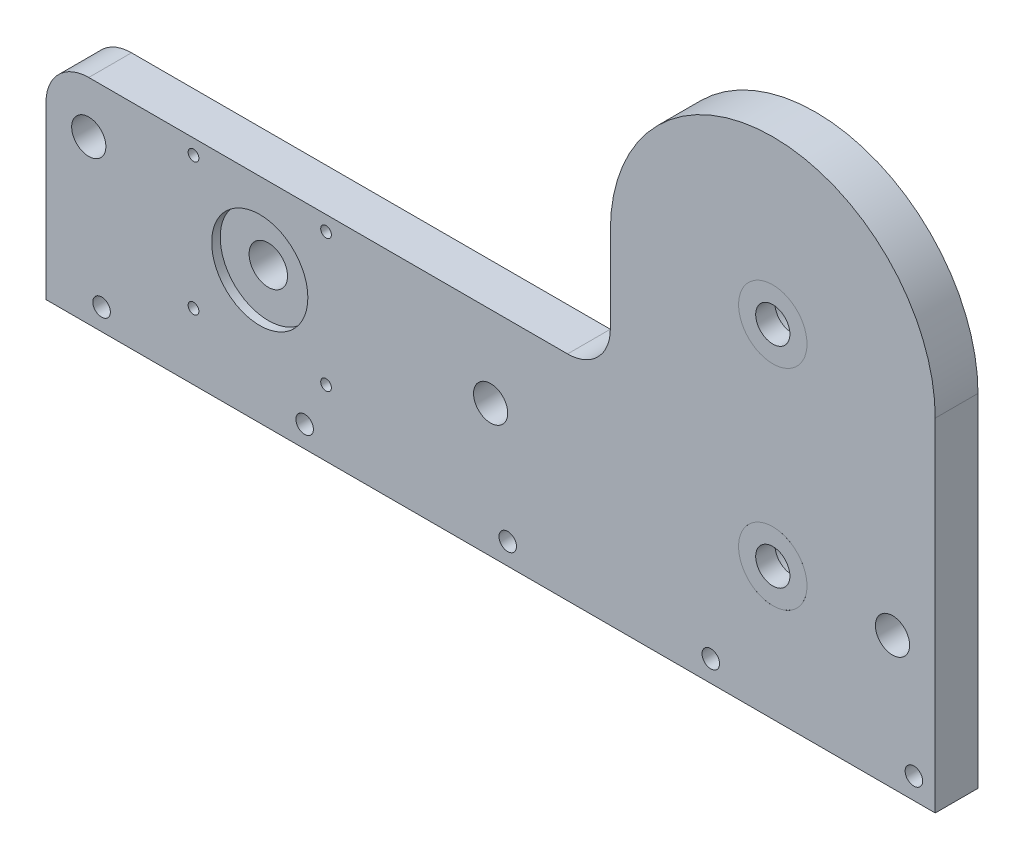
ISO-10303-21;
HEADER;
FILE_DESCRIPTION(('STEP AP214'),'2;1');
FILE_NAME('part.step','',(''),(''),'','','');
FILE_SCHEMA(('AUTOMOTIVE_DESIGN { 1 0 10303 214 1 1 1 1 }'));
ENDSEC;
DATA;
#1=APPLICATION_CONTEXT('core data for automotive mechanical design processes');
#2=APPLICATION_PROTOCOL_DEFINITION('international standard','automotive_design',2000,#1);
#3=PRODUCT_CONTEXT('',#1,'mechanical');
#4=PRODUCT('Part','Part','',(#3));
#5=PRODUCT_RELATED_PRODUCT_CATEGORY('part','',(#4));
#6=PRODUCT_DEFINITION_FORMATION('','',#4);
#7=PRODUCT_DEFINITION_CONTEXT('part definition',#1,'design');
#8=PRODUCT_DEFINITION('design','',#6,#7);
#9=PRODUCT_DEFINITION_SHAPE('','',#8);
#10=(LENGTH_UNIT() NAMED_UNIT(*) SI_UNIT(.MILLI.,.METRE.));
#11=(NAMED_UNIT(*) PLANE_ANGLE_UNIT() SI_UNIT($,.RADIAN.));
#12=(NAMED_UNIT(*) SI_UNIT($,.STERADIAN.) SOLID_ANGLE_UNIT());
#13=UNCERTAINTY_MEASURE_WITH_UNIT(LENGTH_MEASURE(1.E-05),#10,'distance_accuracy_value','');
#14=(GEOMETRIC_REPRESENTATION_CONTEXT(3) GLOBAL_UNCERTAINTY_ASSIGNED_CONTEXT((#13)) GLOBAL_UNIT_ASSIGNED_CONTEXT((#10,
#11,#12)) REPRESENTATION_CONTEXT('',''));
#15=CARTESIAN_POINT('',(0.,0.,0.));
#16=DIRECTION('',(0.,0.,1.));
#17=DIRECTION('',(1.,0.,0.));
#18=AXIS2_PLACEMENT_3D('',#15,#16,#17);
#19=CARTESIAN_POINT('',(170.,80.,-4.5));
#20=DIRECTION('',(0.,0.,1.));
#21=DIRECTION('',(1.,0.,0.));
#22=AXIS2_PLACEMENT_3D('',#19,#20,#21);
#23=CYLINDRICAL_SURFACE('',#22,7.99999999999998);
#24=CARTESIAN_POINT('',(170.,80.,-4.5));
#25=DIRECTION('',(0.,0.,1.));
#26=DIRECTION('',(1.,0.,0.));
#27=AXIS2_PLACEMENT_3D('',#24,#25,#26);
#28=CIRCLE('',#27,7.99999999999998);
#29=CARTESIAN_POINT('',(178.,80.,-4.5));
#30=VERTEX_POINT('',#29);
#31=EDGE_CURVE('E65',#30,#30,#28,.T.);
#32=ORIENTED_EDGE('',*,*,#31,.T.);
#33=EDGE_LOOP('',(#32));
#34=FACE_BOUND('',#33,.T.);
#35=CARTESIAN_POINT('',(170.,80.,0.));
#36=DIRECTION('',(0.,0.,1.));
#37=DIRECTION('',(1.,0.,0.));
#38=AXIS2_PLACEMENT_3D('',#35,#36,#37);
#39=CIRCLE('',#38,7.99999999999998);
#40=CARTESIAN_POINT('',(178.,80.,0.));
#41=VERTEX_POINT('',#40);
#42=EDGE_CURVE('E63',#41,#41,#39,.T.);
#43=ORIENTED_EDGE('',*,*,#42,.F.);
#44=EDGE_LOOP('',(#43));
#45=FACE_BOUND('',#44,.T.);
#46=ADVANCED_FACE('F52',(#34,#45),#23,.T.);
#47=CARTESIAN_POINT('',(170.,80.,-4.5));
#48=DIRECTION('',(0.,0.,1.));
#49=DIRECTION('',(1.,0.,0.));
#50=AXIS2_PLACEMENT_3D('',#47,#48,#49);
#51=PLANE('',#50);
#52=CARTESIAN_POINT('',(170.,80.,-4.5));
#53=DIRECTION('',(0.,0.,1.));
#54=DIRECTION('',(1.,0.,0.));
#55=AXIS2_PLACEMENT_3D('',#52,#53,#54);
#56=CIRCLE('',#55,3.99999999999999);
#57=CARTESIAN_POINT('',(174.,80.,-4.5));
#58=VERTEX_POINT('',#57);
#59=EDGE_CURVE('E56',#58,#58,#56,.T.);
#60=ORIENTED_EDGE('',*,*,#59,.T.);
#61=EDGE_LOOP('',(#60));
#62=FACE_BOUND('',#61,.T.);
#63=ORIENTED_EDGE('',*,*,#31,.F.);
#64=EDGE_LOOP('',(#63));
#65=FACE_BOUND('',#64,.T.);
#66=ADVANCED_FACE('F74',(#62,#65),#51,.F.);
#67=CARTESIAN_POINT('',(170.,80.,0.));
#68=DIRECTION('',(0.,0.,1.));
#69=DIRECTION('',(1.,0.,0.));
#70=AXIS2_PLACEMENT_3D('',#67,#68,#69);
#71=PLANE('',#70);
#72=CARTESIAN_POINT('',(170.,80.,0.));
#73=DIRECTION('',(0.,0.,1.));
#74=DIRECTION('',(1.,0.,0.));
#75=AXIS2_PLACEMENT_3D('',#72,#73,#74);
#76=CIRCLE('',#75,3.99999999999999);
#77=CARTESIAN_POINT('',(174.,80.,0.));
#78=VERTEX_POINT('',#77);
#79=EDGE_CURVE('E11',#78,#78,#76,.T.);
#80=ORIENTED_EDGE('',*,*,#79,.F.);
#81=EDGE_LOOP('',(#80));
#82=FACE_BOUND('',#81,.T.);
#83=ORIENTED_EDGE('',*,*,#42,.T.);
#84=EDGE_LOOP('',(#83));
#85=FACE_BOUND('',#84,.T.);
#86=ADVANCED_FACE('F71',(#82,#85),#71,.T.);
#87=CARTESIAN_POINT('',(170.,80.,-4.5));
#88=DIRECTION('',(0.,0.,1.));
#89=DIRECTION('',(1.,0.,0.));
#90=AXIS2_PLACEMENT_3D('',#87,#88,#89);
#91=CYLINDRICAL_SURFACE('',#90,3.99999999999999);
#92=ORIENTED_EDGE('',*,*,#59,.F.);
#93=EDGE_LOOP('',(#92));
#94=FACE_BOUND('',#93,.T.);
#95=ORIENTED_EDGE('',*,*,#79,.T.);
#96=EDGE_LOOP('',(#95));
#97=FACE_BOUND('',#96,.T.);
#98=ADVANCED_FACE('F54',(#94,#97),#91,.F.);
#99=CLOSED_SHELL('',(#46,#66,#86,#98));
#100=MANIFOLD_SOLID_BREP('B2',#99);
#101=CARTESIAN_POINT('',(170.,31.,-4.5));
#102=DIRECTION('',(0.,0.,1.));
#103=DIRECTION('',(1.,0.,0.));
#104=AXIS2_PLACEMENT_3D('',#101,#102,#103);
#105=CYLINDRICAL_SURFACE('',#104,8.00000000000001);
#106=CARTESIAN_POINT('',(170.,31.,-4.5));
#107=DIRECTION('',(0.,0.,1.));
#108=DIRECTION('',(1.,0.,0.));
#109=AXIS2_PLACEMENT_3D('',#106,#107,#108);
#110=CIRCLE('',#109,8.00000000000001);
#111=CARTESIAN_POINT('',(178.,31.,-4.5));
#112=VERTEX_POINT('',#111);
#113=EDGE_CURVE('E51',#112,#112,#110,.T.);
#114=ORIENTED_EDGE('',*,*,#113,.T.);
#115=EDGE_LOOP('',(#114));
#116=FACE_BOUND('',#115,.T.);
#117=CARTESIAN_POINT('',(170.,31.,0.));
#118=DIRECTION('',(0.,0.,1.));
#119=DIRECTION('',(1.,0.,0.));
#120=AXIS2_PLACEMENT_3D('',#117,#118,#119);
#121=CIRCLE('',#120,8.00000000000001);
#122=CARTESIAN_POINT('',(178.,31.,0.));
#123=VERTEX_POINT('',#122);
#124=EDGE_CURVE('E126',#123,#123,#121,.T.);
#125=ORIENTED_EDGE('',*,*,#124,.F.);
#126=EDGE_LOOP('',(#125));
#127=FACE_BOUND('',#126,.T.);
#128=ADVANCED_FACE('F123',(#116,#127),#105,.T.);
#129=CARTESIAN_POINT('',(170.,31.,-4.5));
#130=DIRECTION('',(0.,0.,1.));
#131=DIRECTION('',(1.,0.,0.));
#132=AXIS2_PLACEMENT_3D('',#129,#130,#131);
#133=PLANE('',#132);
#134=CARTESIAN_POINT('',(170.,31.,-4.5));
#135=DIRECTION('',(0.,0.,1.));
#136=DIRECTION('',(1.,0.,0.));
#137=AXIS2_PLACEMENT_3D('',#134,#135,#136);
#138=CIRCLE('',#137,3.99999999999999);
#139=CARTESIAN_POINT('',(174.,31.,-4.5));
#140=VERTEX_POINT('',#139);
#141=EDGE_CURVE('E133',#140,#140,#138,.T.);
#142=ORIENTED_EDGE('',*,*,#141,.T.);
#143=EDGE_LOOP('',(#142));
#144=FACE_BOUND('',#143,.T.);
#145=ORIENTED_EDGE('',*,*,#113,.F.);
#146=EDGE_LOOP('',(#145));
#147=FACE_BOUND('',#146,.T.);
#148=ADVANCED_FACE('F141',(#144,#147),#133,.F.);
#149=CARTESIAN_POINT('',(170.,31.,0.));
#150=DIRECTION('',(0.,0.,1.));
#151=DIRECTION('',(1.,0.,0.));
#152=AXIS2_PLACEMENT_3D('',#149,#150,#151);
#153=PLANE('',#152);
#154=CARTESIAN_POINT('',(170.,31.,0.));
#155=DIRECTION('',(0.,0.,1.));
#156=DIRECTION('',(1.,0.,0.));
#157=AXIS2_PLACEMENT_3D('',#154,#155,#156);
#158=CIRCLE('',#157,3.99999999999999);
#159=CARTESIAN_POINT('',(174.,31.,0.));
#160=VERTEX_POINT('',#159);
#161=EDGE_CURVE('E135',#160,#160,#158,.T.);
#162=ORIENTED_EDGE('',*,*,#161,.F.);
#163=EDGE_LOOP('',(#162));
#164=FACE_BOUND('',#163,.T.);
#165=ORIENTED_EDGE('',*,*,#124,.T.);
#166=EDGE_LOOP('',(#165));
#167=FACE_BOUND('',#166,.T.);
#168=ADVANCED_FACE('F147',(#164,#167),#153,.T.);
#169=CARTESIAN_POINT('',(170.,31.,-4.5));
#170=DIRECTION('',(0.,0.,1.));
#171=DIRECTION('',(1.,0.,0.));
#172=AXIS2_PLACEMENT_3D('',#169,#170,#171);
#173=CYLINDRICAL_SURFACE('',#172,3.99999999999999);
#174=ORIENTED_EDGE('',*,*,#141,.F.);
#175=EDGE_LOOP('',(#174));
#176=FACE_BOUND('',#175,.T.);
#177=ORIENTED_EDGE('',*,*,#161,.T.);
#178=EDGE_LOOP('',(#177));
#179=FACE_BOUND('',#178,.T.);
#180=ADVANCED_FACE('F144',(#176,#179),#173,.F.);
#181=CLOSED_SHELL('',(#128,#148,#168,#180));
#182=MANIFOLD_SOLID_BREP('B6',#181);
#183=CARTESIAN_POINT('',(50.,31.,-10.));
#184=DIRECTION('',(0.,0.,1.));
#185=DIRECTION('',(1.,0.,0.));
#186=AXIS2_PLACEMENT_3D('',#183,#184,#185);
#187=CYLINDRICAL_SURFACE('',#186,4.5);
#188=CARTESIAN_POINT('',(50.,31.,-10.));
#189=DIRECTION('',(0.,0.,1.));
#190=DIRECTION('',(1.,0.,0.));
#191=AXIS2_PLACEMENT_3D('',#188,#189,#190);
#192=CIRCLE('',#191,4.5);
#193=CARTESIAN_POINT('',(54.5,31.,-10.));
#194=VERTEX_POINT('',#193);
#195=EDGE_CURVE('E295',#194,#194,#192,.T.);
#196=ORIENTED_EDGE('',*,*,#195,.F.);
#197=EDGE_LOOP('',(#196));
#198=FACE_BOUND('',#197,.T.);
#199=CARTESIAN_POINT('',(50.,31.,-2.));
#200=DIRECTION('',(0.,0.,1.));
#201=DIRECTION('',(1.,0.,0.));
#202=AXIS2_PLACEMENT_3D('',#199,#200,#201);
#203=CIRCLE('',#202,4.5);
#204=CARTESIAN_POINT('',(54.5,31.,-2.));
#205=VERTEX_POINT('',#204);
#206=EDGE_CURVE('E189',#205,#205,#203,.F.);
#207=ORIENTED_EDGE('',*,*,#206,.F.);
#208=EDGE_LOOP('',(#207));
#209=FACE_BOUND('',#208,.T.);
#210=ADVANCED_FACE('F185',(#198,#209),#187,.F.);
#211=CARTESIAN_POINT('',(0.,0.,-10.));
#212=DIRECTION('',(-1.,0.,0.));
#213=DIRECTION('',(0.,0.,1.));
#214=AXIS2_PLACEMENT_3D('',#211,#212,#213);
#215=PLANE('',#214);
#216=DIRECTION('',(0.,-1.,0.));
#217=VECTOR('',#216,1.);
#218=CARTESIAN_POINT('',(0.,0.,0.));
#219=LINE('',#218,#217);
#220=CARTESIAN_POINT('',(0.,40.,0.));
#221=VERTEX_POINT('',#220);
#222=CARTESIAN_POINT('',(0.,0.,0.));
#223=VERTEX_POINT('',#222);
#224=EDGE_CURVE('E290',#221,#223,#219,.T.);
#225=ORIENTED_EDGE('',*,*,#224,.F.);
#226=DIRECTION('',(0.,0.,1.));
#227=VECTOR('',#226,1.);
#228=CARTESIAN_POINT('',(0.,40.,-10.));
#229=LINE('',#228,#227);
#230=CARTESIAN_POINT('',(0.,40.,-10.));
#231=VERTEX_POINT('',#230);
#232=EDGE_CURVE('E121',#231,#221,#229,.T.);
#233=ORIENTED_EDGE('',*,*,#232,.F.);
#234=DIRECTION('',(0.,-1.,0.));
#235=VECTOR('',#234,1.);
#236=CARTESIAN_POINT('',(0.,0.,-10.));
#237=LINE('',#236,#235);
#238=CARTESIAN_POINT('',(0.,0.,-10.));
#239=VERTEX_POINT('',#238);
#240=EDGE_CURVE('E319',#231,#239,#237,.T.);
#241=ORIENTED_EDGE('',*,*,#240,.T.);
#242=DIRECTION('',(0.,0.,1.));
#243=VECTOR('',#242,1.);
#244=CARTESIAN_POINT('',(0.,0.,-10.));
#245=LINE('',#244,#243);
#246=EDGE_CURVE('E243',#239,#223,#245,.T.);
#247=ORIENTED_EDGE('',*,*,#246,.T.);
#248=EDGE_LOOP('',(#225,#233,#241,#247));
#249=FACE_BOUND('',#248,.T.);
#250=ADVANCED_FACE('F187',(#249),#215,.T.);
#251=CARTESIAN_POINT('',(10.,40.,-10.));
#252=DIRECTION('',(0.,0.,1.));
#253=DIRECTION('',(1.,0.,0.));
#254=AXIS2_PLACEMENT_3D('',#251,#252,#253);
#255=CYLINDRICAL_SURFACE('',#254,10.);
#256=CARTESIAN_POINT('',(10.,40.,0.));
#257=DIRECTION('',(0.,0.,1.));
#258=DIRECTION('',(-1.,0.,0.));
#259=AXIS2_PLACEMENT_3D('',#256,#257,#258);
#260=CIRCLE('',#259,10.);
#261=CARTESIAN_POINT('',(10.,50.,0.));
#262=VERTEX_POINT('',#261);
#263=EDGE_CURVE('E316',#262,#221,#260,.T.);
#264=ORIENTED_EDGE('',*,*,#263,.F.);
#265=DIRECTION('',(0.,0.,1.));
#266=VECTOR('',#265,1.);
#267=CARTESIAN_POINT('',(10.,50.,-10.));
#268=LINE('',#267,#266);
#269=CARTESIAN_POINT('',(10.,50.,-10.));
#270=VERTEX_POINT('',#269);
#271=EDGE_CURVE('E196',#270,#262,#268,.T.);
#272=ORIENTED_EDGE('',*,*,#271,.F.);
#273=CARTESIAN_POINT('',(10.,40.,-10.));
#274=DIRECTION('',(0.,0.,1.));
#275=DIRECTION('',(-1.,0.,0.));
#276=AXIS2_PLACEMENT_3D('',#273,#274,#275);
#277=CIRCLE('',#276,10.);
#278=EDGE_CURVE('E276',#270,#231,#277,.T.);
#279=ORIENTED_EDGE('',*,*,#278,.T.);
#280=ORIENTED_EDGE('',*,*,#232,.T.);
#281=EDGE_LOOP('',(#264,#272,#279,#280));
#282=FACE_BOUND('',#281,.T.);
#283=ADVANCED_FACE('F338',(#282),#255,.T.);
#284=CARTESIAN_POINT('',(10.,50.,-10.));
#285=DIRECTION('',(0.,1.,0.));
#286=DIRECTION('',(0.,0.,1.));
#287=AXIS2_PLACEMENT_3D('',#284,#285,#286);
#288=PLANE('',#287);
#289=DIRECTION('',(-1.,0.,0.));
#290=VECTOR('',#289,1.);
#291=CARTESIAN_POINT('',(10.,50.,0.));
#292=LINE('',#291,#290);
#293=CARTESIAN_POINT('',(122.,50.,0.));
#294=VERTEX_POINT('',#293);
#295=EDGE_CURVE('E262',#294,#262,#292,.T.);
#296=ORIENTED_EDGE('',*,*,#295,.F.);
#297=DIRECTION('',(0.,0.,1.));
#298=VECTOR('',#297,1.);
#299=CARTESIAN_POINT('',(122.,50.,-10.));
#300=LINE('',#299,#298);
#301=CARTESIAN_POINT('',(122.,50.,-10.));
#302=VERTEX_POINT('',#301);
#303=EDGE_CURVE('E257',#302,#294,#300,.T.);
#304=ORIENTED_EDGE('',*,*,#303,.F.);
#305=DIRECTION('',(-1.,0.,0.));
#306=VECTOR('',#305,1.);
#307=CARTESIAN_POINT('',(10.,50.,-10.));
#308=LINE('',#307,#306);
#309=EDGE_CURVE('E260',#302,#270,#308,.T.);
#310=ORIENTED_EDGE('',*,*,#309,.T.);
#311=ORIENTED_EDGE('',*,*,#271,.T.);
#312=EDGE_LOOP('',(#296,#304,#310,#311));
#313=FACE_BOUND('',#312,.T.);
#314=ADVANCED_FACE('F259',(#313),#288,.T.);
#315=CARTESIAN_POINT('',(122.,60.,-10.));
#316=DIRECTION('',(0.,0.,1.));
#317=DIRECTION('',(1.,0.,0.));
#318=AXIS2_PLACEMENT_3D('',#315,#316,#317);
#319=CYLINDRICAL_SURFACE('',#318,10.);
#320=CARTESIAN_POINT('',(122.,60.,0.));
#321=DIRECTION('',(0.,0.,-1.));
#322=DIRECTION('',(1.,0.,0.));
#323=AXIS2_PLACEMENT_3D('',#320,#321,#322);
#324=CIRCLE('',#323,10.);
#325=CARTESIAN_POINT('',(132.,60.,0.));
#326=VERTEX_POINT('',#325);
#327=EDGE_CURVE('E311',#326,#294,#324,.T.);
#328=ORIENTED_EDGE('',*,*,#327,.F.);
#329=DIRECTION('',(0.,0.,1.));
#330=VECTOR('',#329,1.);
#331=CARTESIAN_POINT('',(132.,60.,-10.));
#332=LINE('',#331,#330);
#333=CARTESIAN_POINT('',(132.,60.,-10.));
#334=VERTEX_POINT('',#333);
#335=EDGE_CURVE('E268',#334,#326,#332,.T.);
#336=ORIENTED_EDGE('',*,*,#335,.F.);
#337=CARTESIAN_POINT('',(122.,60.,-10.));
#338=DIRECTION('',(0.,0.,-1.));
#339=DIRECTION('',(1.,0.,0.));
#340=AXIS2_PLACEMENT_3D('',#337,#338,#339);
#341=CIRCLE('',#340,10.);
#342=EDGE_CURVE('E274',#334,#302,#341,.T.);
#343=ORIENTED_EDGE('',*,*,#342,.T.);
#344=ORIENTED_EDGE('',*,*,#303,.T.);
#345=EDGE_LOOP('',(#328,#336,#343,#344));
#346=FACE_BOUND('',#345,.T.);
#347=ADVANCED_FACE('F279',(#346),#319,.F.);
#348=CARTESIAN_POINT('',(132.,60.,-10.));
#349=DIRECTION('',(-1.,0.,0.));
#350=DIRECTION('',(0.,0.,1.));
#351=AXIS2_PLACEMENT_3D('',#348,#349,#350);
#352=PLANE('',#351);
#353=DIRECTION('',(0.,-1.,0.));
#354=VECTOR('',#353,1.);
#355=CARTESIAN_POINT('',(132.,60.,0.));
#356=LINE('',#355,#354);
#357=CARTESIAN_POINT('',(132.,80.,0.));
#358=VERTEX_POINT('',#357);
#359=EDGE_CURVE('E307',#358,#326,#356,.T.);
#360=ORIENTED_EDGE('',*,*,#359,.F.);
#361=DIRECTION('',(0.,0.,1.));
#362=VECTOR('',#361,1.);
#363=CARTESIAN_POINT('',(132.,80.,-10.));
#364=LINE('',#363,#362);
#365=CARTESIAN_POINT('',(132.,80.,-10.));
#366=VERTEX_POINT('',#365);
#367=EDGE_CURVE('E325',#366,#358,#364,.T.);
#368=ORIENTED_EDGE('',*,*,#367,.F.);
#369=DIRECTION('',(0.,-1.,0.));
#370=VECTOR('',#369,1.);
#371=CARTESIAN_POINT('',(132.,60.,-10.));
#372=LINE('',#371,#370);
#373=EDGE_CURVE('E281',#366,#334,#372,.T.);
#374=ORIENTED_EDGE('',*,*,#373,.T.);
#375=ORIENTED_EDGE('',*,*,#335,.T.);
#376=EDGE_LOOP('',(#360,#368,#374,#375));
#377=FACE_BOUND('',#376,.T.);
#378=ADVANCED_FACE('F464',(#377),#352,.T.);
#379=CARTESIAN_POINT('',(170.,80.,-10.));
#380=DIRECTION('',(0.,0.,1.));
#381=DIRECTION('',(1.,0.,0.));
#382=AXIS2_PLACEMENT_3D('',#379,#380,#381);
#383=CYLINDRICAL_SURFACE('',#382,38.);
#384=CARTESIAN_POINT('',(170.,80.,0.));
#385=DIRECTION('',(0.,0.,1.));
#386=DIRECTION('',(1.,0.,0.));
#387=AXIS2_PLACEMENT_3D('',#384,#385,#386);
#388=CIRCLE('',#387,38.);
#389=CARTESIAN_POINT('',(208.,80.,0.));
#390=VERTEX_POINT('',#389);
#391=EDGE_CURVE('E303',#390,#358,#388,.T.);
#392=ORIENTED_EDGE('',*,*,#391,.F.);
#393=DIRECTION('',(0.,0.,1.));
#394=VECTOR('',#393,1.);
#395=CARTESIAN_POINT('',(208.,80.,-10.));
#396=LINE('',#395,#394);
#397=CARTESIAN_POINT('',(208.,80.,-10.));
#398=VERTEX_POINT('',#397);
#399=EDGE_CURVE('E328',#398,#390,#396,.T.);
#400=ORIENTED_EDGE('',*,*,#399,.F.);
#401=CARTESIAN_POINT('',(170.,80.,-10.));
#402=DIRECTION('',(0.,0.,1.));
#403=DIRECTION('',(1.,0.,0.));
#404=AXIS2_PLACEMENT_3D('',#401,#402,#403);
#405=CIRCLE('',#404,38.);
#406=EDGE_CURVE('E284',#398,#366,#405,.T.);
#407=ORIENTED_EDGE('',*,*,#406,.T.);
#408=ORIENTED_EDGE('',*,*,#367,.T.);
#409=EDGE_LOOP('',(#392,#400,#407,#408));
#410=FACE_BOUND('',#409,.T.);
#411=ADVANCED_FACE('F458',(#410),#383,.T.);
#412=CARTESIAN_POINT('',(208.,0.,-10.));
#413=DIRECTION('',(1.,0.,0.));
#414=DIRECTION('',(0.,0.,-1.));
#415=AXIS2_PLACEMENT_3D('',#412,#413,#414);
#416=PLANE('',#415);
#417=DIRECTION('',(0.,1.,0.));
#418=VECTOR('',#417,1.);
#419=CARTESIAN_POINT('',(208.,0.,0.));
#420=LINE('',#419,#418);
#421=CARTESIAN_POINT('',(208.,0.,0.));
#422=VERTEX_POINT('',#421);
#423=EDGE_CURVE('E299',#422,#390,#420,.T.);
#424=ORIENTED_EDGE('',*,*,#423,.F.);
#425=DIRECTION('',(0.,0.,1.));
#426=VECTOR('',#425,1.);
#427=CARTESIAN_POINT('',(208.,0.,-10.));
#428=LINE('',#427,#426);
#429=CARTESIAN_POINT('',(208.,0.,-10.));
#430=VERTEX_POINT('',#429);
#431=EDGE_CURVE('E331',#430,#422,#428,.T.);
#432=ORIENTED_EDGE('',*,*,#431,.F.);
#433=DIRECTION('',(0.,1.,0.));
#434=VECTOR('',#433,1.);
#435=CARTESIAN_POINT('',(208.,0.,-10.));
#436=LINE('',#435,#434);
#437=EDGE_CURVE('E450',#430,#398,#436,.T.);
#438=ORIENTED_EDGE('',*,*,#437,.T.);
#439=ORIENTED_EDGE('',*,*,#399,.T.);
#440=EDGE_LOOP('',(#424,#432,#438,#439));
#441=FACE_BOUND('',#440,.T.);
#442=ADVANCED_FACE('F462',(#441),#416,.T.);
#443=CARTESIAN_POINT('',(0.,0.,-10.));
#444=DIRECTION('',(0.,-1.,0.));
#445=DIRECTION('',(0.,0.,-1.));
#446=AXIS2_PLACEMENT_3D('',#443,#444,#445);
#447=PLANE('',#446);
#448=DIRECTION('',(1.,0.,0.));
#449=VECTOR('',#448,1.);
#450=CARTESIAN_POINT('',(0.,0.,0.));
#451=LINE('',#450,#449);
#452=EDGE_CURVE('E294',#223,#422,#451,.T.);
#453=ORIENTED_EDGE('',*,*,#452,.F.);
#454=ORIENTED_EDGE('',*,*,#246,.F.);
#455=DIRECTION('',(1.,0.,0.));
#456=VECTOR('',#455,1.);
#457=CARTESIAN_POINT('',(0.,0.,-10.));
#458=LINE('',#457,#456);
#459=EDGE_CURVE('E447',#239,#430,#458,.T.);
#460=ORIENTED_EDGE('',*,*,#459,.T.);
#461=ORIENTED_EDGE('',*,*,#431,.T.);
#462=EDGE_LOOP('',(#453,#454,#460,#461));
#463=FACE_BOUND('',#462,.T.);
#464=ADVANCED_FACE('F334',(#463),#447,.T.);
#465=CARTESIAN_POINT('',(10.,40.,-10.));
#466=DIRECTION('',(0.,0.,-1.));
#467=DIRECTION('',(-1.,0.,0.));
#468=AXIS2_PLACEMENT_3D('',#465,#466,#467);
#469=PLANE('',#468);
#470=CARTESIAN_POINT('',(198.,31.,-10.));
#471=DIRECTION('',(0.,0.,-1.));
#472=DIRECTION('',(-1.,0.,0.));
#473=AXIS2_PLACEMENT_3D('',#470,#471,#472);
#474=CIRCLE('',#473,3.99999999999999);
#475=CARTESIAN_POINT('',(194.,31.,-10.));
#476=VERTEX_POINT('',#475);
#477=EDGE_CURVE('E638',#476,#476,#474,.T.);
#478=ORIENTED_EDGE('',*,*,#477,.F.);
#479=EDGE_LOOP('',(#478));
#480=FACE_BOUND('',#479,.T.);
#481=CARTESIAN_POINT('',(104.,31.,-10.));
#482=DIRECTION('',(0.,0.,-1.));
#483=DIRECTION('',(-1.,0.,0.));
#484=AXIS2_PLACEMENT_3D('',#481,#482,#483);
#485=CIRCLE('',#484,4.00000000000001);
#486=CARTESIAN_POINT('',(100.,31.,-10.));
#487=VERTEX_POINT('',#486);
#488=EDGE_CURVE('E640',#487,#487,#485,.T.);
#489=ORIENTED_EDGE('',*,*,#488,.F.);
#490=EDGE_LOOP('',(#489));
#491=FACE_BOUND('',#490,.T.);
#492=CARTESIAN_POINT('',(9.99999999999999,38.,-10.));
#493=DIRECTION('',(0.,0.,-1.));
#494=DIRECTION('',(-1.,0.,0.));
#495=AXIS2_PLACEMENT_3D('',#492,#493,#494);
#496=CIRCLE('',#495,4.);
#497=CARTESIAN_POINT('',(5.99999999999999,38.,-10.));
#498=VERTEX_POINT('',#497);
#499=EDGE_CURVE('E650',#498,#498,#496,.T.);
#500=ORIENTED_EDGE('',*,*,#499,.F.);
#501=EDGE_LOOP('',(#500));
#502=FACE_BOUND('',#501,.T.);
#503=CARTESIAN_POINT('',(203.,5.,-10.));
#504=DIRECTION('',(0.,0.,-1.));
#505=DIRECTION('',(-1.,0.,0.));
#506=AXIS2_PLACEMENT_3D('',#503,#504,#505);
#507=CIRCLE('',#506,2.04999999999999);
#508=CARTESIAN_POINT('',(200.95,5.,-10.));
#509=VERTEX_POINT('',#508);
#510=EDGE_CURVE('E659',#509,#509,#507,.T.);
#511=ORIENTED_EDGE('',*,*,#510,.F.);
#512=EDGE_LOOP('',(#511));
#513=FACE_BOUND('',#512,.T.);
#514=CARTESIAN_POINT('',(155.5,5.,-10.));
#515=DIRECTION('',(0.,0.,-1.));
#516=DIRECTION('',(-1.,0.,0.));
#517=AXIS2_PLACEMENT_3D('',#514,#515,#516);
#518=CIRCLE('',#517,2.04999999999999);
#519=CARTESIAN_POINT('',(153.45,5.,-10.));
#520=VERTEX_POINT('',#519);
#521=EDGE_CURVE('E663',#520,#520,#518,.T.);
#522=ORIENTED_EDGE('',*,*,#521,.F.);
#523=EDGE_LOOP('',(#522));
#524=FACE_BOUND('',#523,.T.);
#525=CARTESIAN_POINT('',(108.,5.,-10.));
#526=DIRECTION('',(0.,0.,-1.));
#527=DIRECTION('',(-1.,0.,0.));
#528=AXIS2_PLACEMENT_3D('',#525,#526,#527);
#529=CIRCLE('',#528,2.04999999999999);
#530=CARTESIAN_POINT('',(105.95,5.,-10.));
#531=VERTEX_POINT('',#530);
#532=EDGE_CURVE('E669',#531,#531,#529,.T.);
#533=ORIENTED_EDGE('',*,*,#532,.F.);
#534=EDGE_LOOP('',(#533));
#535=FACE_BOUND('',#534,.T.);
#536=CARTESIAN_POINT('',(60.5,5.,-10.));
#537=DIRECTION('',(0.,0.,-1.));
#538=DIRECTION('',(-1.,0.,0.));
#539=AXIS2_PLACEMENT_3D('',#536,#537,#538);
#540=CIRCLE('',#539,2.04999999999999);
#541=CARTESIAN_POINT('',(58.45,5.,-10.));
#542=VERTEX_POINT('',#541);
#543=EDGE_CURVE('E675',#542,#542,#540,.T.);
#544=ORIENTED_EDGE('',*,*,#543,.F.);
#545=EDGE_LOOP('',(#544));
#546=FACE_BOUND('',#545,.T.);
#547=CARTESIAN_POINT('',(13.,5.,-10.));
#548=DIRECTION('',(0.,0.,-1.));
#549=DIRECTION('',(-1.,0.,0.));
#550=AXIS2_PLACEMENT_3D('',#547,#548,#549);
#551=CIRCLE('',#550,2.05);
#552=CARTESIAN_POINT('',(10.95,5.,-10.));
#553=VERTEX_POINT('',#552);
#554=EDGE_CURVE('E681',#553,#553,#551,.T.);
#555=ORIENTED_EDGE('',*,*,#554,.F.);
#556=EDGE_LOOP('',(#555));
#557=FACE_BOUND('',#556,.T.);
#558=CARTESIAN_POINT('',(170.,31.,-10.));
#559=DIRECTION('',(0.,0.,-1.));
#560=DIRECTION('',(-1.,0.,0.));
#561=AXIS2_PLACEMENT_3D('',#558,#559,#560);
#562=CIRCLE('',#561,8.00000000000001);
#563=CARTESIAN_POINT('',(162.,31.,-10.));
#564=VERTEX_POINT('',#563);
#565=EDGE_CURVE('E658',#564,#564,#562,.T.);
#566=ORIENTED_EDGE('',*,*,#565,.F.);
#567=EDGE_LOOP('',(#566));
#568=FACE_BOUND('',#567,.T.);
#569=CARTESIAN_POINT('',(65.5000000000004,15.5000000000001,-10.));
#570=DIRECTION('',(0.,0.,1.));
#571=DIRECTION('',(1.,0.,0.));
#572=AXIS2_PLACEMENT_3D('',#569,#570,#571);
#573=CIRCLE('',#572,1.24999999999989);
#574=CARTESIAN_POINT('',(66.7500000000003,15.5000000000001,-10.));
#575=VERTEX_POINT('',#574);
#576=EDGE_CURVE('E698',#575,#575,#573,.T.);
#577=ORIENTED_EDGE('',*,*,#576,.T.);
#578=EDGE_LOOP('',(#577));
#579=FACE_BOUND('',#578,.T.);
#580=CARTESIAN_POINT('',(34.5000000000003,15.4999999999998,-10.));
#581=DIRECTION('',(0.,0.,1.));
#582=DIRECTION('',(1.,0.,0.));
#583=AXIS2_PLACEMENT_3D('',#580,#581,#582);
#584=CIRCLE('',#583,1.25);
#585=CARTESIAN_POINT('',(35.7500000000003,15.4999999999998,-10.));
#586=VERTEX_POINT('',#585);
#587=EDGE_CURVE('E704',#586,#586,#584,.T.);
#588=ORIENTED_EDGE('',*,*,#587,.T.);
#589=EDGE_LOOP('',(#588));
#590=FACE_BOUND('',#589,.T.);
#591=CARTESIAN_POINT('',(34.5,46.4999999999998,-10.));
#592=DIRECTION('',(0.,0.,1.));
#593=DIRECTION('',(1.,0.,0.));
#594=AXIS2_PLACEMENT_3D('',#591,#592,#593);
#595=CIRCLE('',#594,1.25);
#596=CARTESIAN_POINT('',(35.75,46.4999999999998,-10.));
#597=VERTEX_POINT('',#596);
#598=EDGE_CURVE('E710',#597,#597,#595,.T.);
#599=ORIENTED_EDGE('',*,*,#598,.T.);
#600=EDGE_LOOP('',(#599));
#601=FACE_BOUND('',#600,.T.);
#602=CARTESIAN_POINT('',(65.5,46.5000000000001,-10.));
#603=DIRECTION('',(0.,0.,1.));
#604=DIRECTION('',(1.,0.,0.));
#605=AXIS2_PLACEMENT_3D('',#602,#603,#604);
#606=CIRCLE('',#605,1.24999999999997);
#607=CARTESIAN_POINT('',(66.75,46.5000000000001,-10.));
#608=VERTEX_POINT('',#607);
#609=EDGE_CURVE('E432',#608,#608,#606,.T.);
#610=ORIENTED_EDGE('',*,*,#609,.T.);
#611=EDGE_LOOP('',(#610));
#612=FACE_BOUND('',#611,.T.);
#613=CARTESIAN_POINT('',(170.,80.,-10.));
#614=DIRECTION('',(0.,0.,1.));
#615=DIRECTION('',(1.,0.,0.));
#616=AXIS2_PLACEMENT_3D('',#613,#614,#615);
#617=CIRCLE('',#616,8.00000000000001);
#618=CARTESIAN_POINT('',(178.,80.,-10.));
#619=VERTEX_POINT('',#618);
#620=EDGE_CURVE('E431',#619,#619,#617,.T.);
#621=ORIENTED_EDGE('',*,*,#620,.T.);
#622=EDGE_LOOP('',(#621));
#623=FACE_BOUND('',#622,.T.);
#624=ORIENTED_EDGE('',*,*,#195,.T.);
#625=EDGE_LOOP('',(#624));
#626=FACE_BOUND('',#625,.T.);
#627=ORIENTED_EDGE('',*,*,#240,.F.);
#628=ORIENTED_EDGE('',*,*,#278,.F.);
#629=ORIENTED_EDGE('',*,*,#309,.F.);
#630=ORIENTED_EDGE('',*,*,#342,.F.);
#631=ORIENTED_EDGE('',*,*,#373,.F.);
#632=ORIENTED_EDGE('',*,*,#406,.F.);
#633=ORIENTED_EDGE('',*,*,#437,.F.);
#634=ORIENTED_EDGE('',*,*,#459,.F.);
#635=EDGE_LOOP('',(#627,#628,#629,#630,#631,#632,#633,#634));
#636=FACE_BOUND('',#635,.T.);
#637=ADVANCED_FACE('F272',(#480,#491,#502,#513,#524,#535,#546,#557,#568,#579,#590,#601,#612,
#623,#626,#636),#469,.T.);
#638=CARTESIAN_POINT('',(10.,40.,0.));
#639=DIRECTION('',(0.,0.,-1.));
#640=DIRECTION('',(-1.,0.,0.));
#641=AXIS2_PLACEMENT_3D('',#638,#639,#640);
#642=PLANE('',#641);
#643=CARTESIAN_POINT('',(198.,31.,0.));
#644=DIRECTION('',(0.,0.,-1.));
#645=DIRECTION('',(-1.,0.,0.));
#646=AXIS2_PLACEMENT_3D('',#643,#644,#645);
#647=CIRCLE('',#646,3.99999999999999);
#648=CARTESIAN_POINT('',(194.,31.,0.));
#649=VERTEX_POINT('',#648);
#650=EDGE_CURVE('E373',#649,#649,#647,.T.);
#651=ORIENTED_EDGE('',*,*,#650,.T.);
#652=EDGE_LOOP('',(#651));
#653=FACE_BOUND('',#652,.T.);
#654=CARTESIAN_POINT('',(104.,31.,0.));
#655=DIRECTION('',(0.,0.,-1.));
#656=DIRECTION('',(-1.,0.,0.));
#657=AXIS2_PLACEMENT_3D('',#654,#655,#656);
#658=CIRCLE('',#657,4.00000000000001);
#659=CARTESIAN_POINT('',(100.,31.,0.));
#660=VERTEX_POINT('',#659);
#661=EDGE_CURVE('E377',#660,#660,#658,.T.);
#662=ORIENTED_EDGE('',*,*,#661,.T.);
#663=EDGE_LOOP('',(#662));
#664=FACE_BOUND('',#663,.T.);
#665=CARTESIAN_POINT('',(9.99999999999999,38.,0.));
#666=DIRECTION('',(0.,0.,-1.));
#667=DIRECTION('',(-1.,0.,0.));
#668=AXIS2_PLACEMENT_3D('',#665,#666,#667);
#669=CIRCLE('',#668,4.);
#670=CARTESIAN_POINT('',(5.99999999999999,38.,0.));
#671=VERTEX_POINT('',#670);
#672=EDGE_CURVE('E381',#671,#671,#669,.T.);
#673=ORIENTED_EDGE('',*,*,#672,.T.);
#674=EDGE_LOOP('',(#673));
#675=FACE_BOUND('',#674,.T.);
#676=CARTESIAN_POINT('',(203.,5.,0.));
#677=DIRECTION('',(0.,0.,-1.));
#678=DIRECTION('',(-1.,0.,0.));
#679=AXIS2_PLACEMENT_3D('',#676,#677,#678);
#680=CIRCLE('',#679,2.04999999999999);
#681=CARTESIAN_POINT('',(200.95,5.,0.));
#682=VERTEX_POINT('',#681);
#683=EDGE_CURVE('E385',#682,#682,#680,.T.);
#684=ORIENTED_EDGE('',*,*,#683,.T.);
#685=EDGE_LOOP('',(#684));
#686=FACE_BOUND('',#685,.T.);
#687=CARTESIAN_POINT('',(155.5,5.,0.));
#688=DIRECTION('',(0.,0.,-1.));
#689=DIRECTION('',(-1.,0.,0.));
#690=AXIS2_PLACEMENT_3D('',#687,#688,#689);
#691=CIRCLE('',#690,2.04999999999999);
#692=CARTESIAN_POINT('',(153.45,5.,0.));
#693=VERTEX_POINT('',#692);
#694=EDGE_CURVE('E389',#693,#693,#691,.T.);
#695=ORIENTED_EDGE('',*,*,#694,.T.);
#696=EDGE_LOOP('',(#695));
#697=FACE_BOUND('',#696,.T.);
#698=CARTESIAN_POINT('',(108.,5.,0.));
#699=DIRECTION('',(0.,0.,-1.));
#700=DIRECTION('',(-1.,0.,0.));
#701=AXIS2_PLACEMENT_3D('',#698,#699,#700);
#702=CIRCLE('',#701,2.04999999999999);
#703=CARTESIAN_POINT('',(105.95,5.,0.));
#704=VERTEX_POINT('',#703);
#705=EDGE_CURVE('E393',#704,#704,#702,.T.);
#706=ORIENTED_EDGE('',*,*,#705,.T.);
#707=EDGE_LOOP('',(#706));
#708=FACE_BOUND('',#707,.T.);
#709=CARTESIAN_POINT('',(60.5,5.,0.));
#710=DIRECTION('',(0.,0.,-1.));
#711=DIRECTION('',(-1.,0.,0.));
#712=AXIS2_PLACEMENT_3D('',#709,#710,#711);
#713=CIRCLE('',#712,2.04999999999999);
#714=CARTESIAN_POINT('',(58.45,5.,0.));
#715=VERTEX_POINT('',#714);
#716=EDGE_CURVE('E397',#715,#715,#713,.T.);
#717=ORIENTED_EDGE('',*,*,#716,.T.);
#718=EDGE_LOOP('',(#717));
#719=FACE_BOUND('',#718,.T.);
#720=CARTESIAN_POINT('',(13.,5.,0.));
#721=DIRECTION('',(0.,0.,-1.));
#722=DIRECTION('',(-1.,0.,0.));
#723=AXIS2_PLACEMENT_3D('',#720,#721,#722);
#724=CIRCLE('',#723,2.05);
#725=CARTESIAN_POINT('',(10.95,5.,0.));
#726=VERTEX_POINT('',#725);
#727=EDGE_CURVE('E401',#726,#726,#724,.T.);
#728=ORIENTED_EDGE('',*,*,#727,.T.);
#729=EDGE_LOOP('',(#728));
#730=FACE_BOUND('',#729,.T.);
#731=CARTESIAN_POINT('',(170.,31.,0.));
#732=DIRECTION('',(0.,0.,-1.));
#733=DIRECTION('',(-1.,0.,0.));
#734=AXIS2_PLACEMENT_3D('',#731,#732,#733);
#735=CIRCLE('',#734,8.00000000000001);
#736=CARTESIAN_POINT('',(162.,31.,0.));
#737=VERTEX_POINT('',#736);
#738=EDGE_CURVE('E405',#737,#737,#735,.T.);
#739=ORIENTED_EDGE('',*,*,#738,.T.);
#740=EDGE_LOOP('',(#739));
#741=FACE_BOUND('',#740,.T.);
#742=CARTESIAN_POINT('',(50.,31.,0.));
#743=DIRECTION('',(0.,0.,1.));
#744=DIRECTION('',(1.,0.,0.));
#745=AXIS2_PLACEMENT_3D('',#742,#743,#744);
#746=CIRCLE('',#745,11.25);
#747=CARTESIAN_POINT('',(61.25,31.,0.));
#748=VERTEX_POINT('',#747);
#749=EDGE_CURVE('E409',#748,#748,#746,.T.);
#750=ORIENTED_EDGE('',*,*,#749,.F.);
#751=EDGE_LOOP('',(#750));
#752=FACE_BOUND('',#751,.T.);
#753=CARTESIAN_POINT('',(65.5000000000004,15.5000000000001,0.));
#754=DIRECTION('',(0.,0.,1.));
#755=DIRECTION('',(1.,0.,0.));
#756=AXIS2_PLACEMENT_3D('',#753,#754,#755);
#757=CIRCLE('',#756,1.24999999999989);
#758=CARTESIAN_POINT('',(66.7500000000003,15.5000000000001,0.));
#759=VERTEX_POINT('',#758);
#760=EDGE_CURVE('E413',#759,#759,#757,.T.);
#761=ORIENTED_EDGE('',*,*,#760,.F.);
#762=EDGE_LOOP('',(#761));
#763=FACE_BOUND('',#762,.T.);
#764=CARTESIAN_POINT('',(34.5000000000003,15.4999999999998,0.));
#765=DIRECTION('',(0.,0.,1.));
#766=DIRECTION('',(1.,0.,0.));
#767=AXIS2_PLACEMENT_3D('',#764,#765,#766);
#768=CIRCLE('',#767,1.25);
#769=CARTESIAN_POINT('',(35.7500000000003,15.4999999999998,0.));
#770=VERTEX_POINT('',#769);
#771=EDGE_CURVE('E417',#770,#770,#768,.T.);
#772=ORIENTED_EDGE('',*,*,#771,.F.);
#773=EDGE_LOOP('',(#772));
#774=FACE_BOUND('',#773,.T.);
#775=CARTESIAN_POINT('',(34.5,46.4999999999998,0.));
#776=DIRECTION('',(0.,0.,1.));
#777=DIRECTION('',(1.,0.,0.));
#778=AXIS2_PLACEMENT_3D('',#775,#776,#777);
#779=CIRCLE('',#778,1.25);
#780=CARTESIAN_POINT('',(35.75,46.4999999999998,0.));
#781=VERTEX_POINT('',#780);
#782=EDGE_CURVE('E421',#781,#781,#779,.T.);
#783=ORIENTED_EDGE('',*,*,#782,.F.);
#784=EDGE_LOOP('',(#783));
#785=FACE_BOUND('',#784,.T.);
#786=CARTESIAN_POINT('',(65.5,46.5000000000001,0.));
#787=DIRECTION('',(0.,0.,1.));
#788=DIRECTION('',(1.,0.,0.));
#789=AXIS2_PLACEMENT_3D('',#786,#787,#788);
#790=CIRCLE('',#789,1.24999999999997);
#791=CARTESIAN_POINT('',(66.75,46.5000000000001,0.));
#792=VERTEX_POINT('',#791);
#793=EDGE_CURVE('E425',#792,#792,#790,.T.);
#794=ORIENTED_EDGE('',*,*,#793,.F.);
#795=EDGE_LOOP('',(#794));
#796=FACE_BOUND('',#795,.T.);
#797=CARTESIAN_POINT('',(170.,80.,0.));
#798=DIRECTION('',(0.,0.,1.));
#799=DIRECTION('',(1.,0.,0.));
#800=AXIS2_PLACEMENT_3D('',#797,#798,#799);
#801=CIRCLE('',#800,8.00000000000001);
#802=CARTESIAN_POINT('',(178.,80.,0.));
#803=VERTEX_POINT('',#802);
#804=EDGE_CURVE('E428',#803,#803,#801,.T.);
#805=ORIENTED_EDGE('',*,*,#804,.F.);
#806=EDGE_LOOP('',(#805));
#807=FACE_BOUND('',#806,.T.);
#808=ORIENTED_EDGE('',*,*,#224,.T.);
#809=ORIENTED_EDGE('',*,*,#452,.T.);
#810=ORIENTED_EDGE('',*,*,#423,.T.);
#811=ORIENTED_EDGE('',*,*,#391,.T.);
#812=ORIENTED_EDGE('',*,*,#359,.T.);
#813=ORIENTED_EDGE('',*,*,#327,.T.);
#814=ORIENTED_EDGE('',*,*,#295,.T.);
#815=ORIENTED_EDGE('',*,*,#263,.T.);
#816=EDGE_LOOP('',(#808,#809,#810,#811,#812,#813,#814,#815));
#817=FACE_BOUND('',#816,.T.);
#818=ADVANCED_FACE('F337',(#653,#664,#675,#686,#697,#708,#719,#730,#741,#752,#763,#774,#785,
#796,#807,#817),#642,.F.);
#819=CARTESIAN_POINT('',(170.,80.,-10.));
#820=DIRECTION('',(0.,0.,1.));
#821=DIRECTION('',(1.,0.,0.));
#822=AXIS2_PLACEMENT_3D('',#819,#820,#821);
#823=CYLINDRICAL_SURFACE('',#822,8.00000000000001);
#824=ORIENTED_EDGE('',*,*,#620,.F.);
#825=EDGE_LOOP('',(#824));
#826=FACE_BOUND('',#825,.T.);
#827=ORIENTED_EDGE('',*,*,#804,.T.);
#828=EDGE_LOOP('',(#827));
#829=FACE_BOUND('',#828,.T.);
#830=ADVANCED_FACE('F358',(#826,#829),#823,.F.);
#831=CARTESIAN_POINT('',(65.5,46.5000000000001,-10.));
#832=DIRECTION('',(0.,0.,1.));
#833=DIRECTION('',(1.,0.,0.));
#834=AXIS2_PLACEMENT_3D('',#831,#832,#833);
#835=CYLINDRICAL_SURFACE('',#834,1.24999999999997);
#836=ORIENTED_EDGE('',*,*,#609,.F.);
#837=EDGE_LOOP('',(#836));
#838=FACE_BOUND('',#837,.T.);
#839=ORIENTED_EDGE('',*,*,#793,.T.);
#840=EDGE_LOOP('',(#839));
#841=FACE_BOUND('',#840,.T.);
#842=ADVANCED_FACE('F368',(#838,#841),#835,.F.);
#843=CARTESIAN_POINT('',(34.5,46.4999999999998,-10.));
#844=DIRECTION('',(0.,0.,1.));
#845=DIRECTION('',(1.,0.,0.));
#846=AXIS2_PLACEMENT_3D('',#843,#844,#845);
#847=CYLINDRICAL_SURFACE('',#846,1.25);
#848=ORIENTED_EDGE('',*,*,#598,.F.);
#849=EDGE_LOOP('',(#848));
#850=FACE_BOUND('',#849,.T.);
#851=ORIENTED_EDGE('',*,*,#782,.T.);
#852=EDGE_LOOP('',(#851));
#853=FACE_BOUND('',#852,.T.);
#854=ADVANCED_FACE('F493',(#850,#853),#847,.F.);
#855=CARTESIAN_POINT('',(34.5000000000003,15.4999999999998,-10.));
#856=DIRECTION('',(0.,0.,1.));
#857=DIRECTION('',(1.,0.,0.));
#858=AXIS2_PLACEMENT_3D('',#855,#856,#857);
#859=CYLINDRICAL_SURFACE('',#858,1.25);
#860=ORIENTED_EDGE('',*,*,#587,.F.);
#861=EDGE_LOOP('',(#860));
#862=FACE_BOUND('',#861,.T.);
#863=ORIENTED_EDGE('',*,*,#771,.T.);
#864=EDGE_LOOP('',(#863));
#865=FACE_BOUND('',#864,.T.);
#866=ADVANCED_FACE('F501',(#862,#865),#859,.F.);
#867=CARTESIAN_POINT('',(65.5000000000004,15.5000000000001,-10.));
#868=DIRECTION('',(0.,0.,1.));
#869=DIRECTION('',(1.,0.,0.));
#870=AXIS2_PLACEMENT_3D('',#867,#868,#869);
#871=CYLINDRICAL_SURFACE('',#870,1.24999999999989);
#872=ORIENTED_EDGE('',*,*,#576,.F.);
#873=EDGE_LOOP('',(#872));
#874=FACE_BOUND('',#873,.T.);
#875=ORIENTED_EDGE('',*,*,#760,.T.);
#876=EDGE_LOOP('',(#875));
#877=FACE_BOUND('',#876,.T.);
#878=ADVANCED_FACE('F509',(#874,#877),#871,.F.);
#879=CARTESIAN_POINT('',(50.,31.,-2.));
#880=DIRECTION('',(0.,0.,1.));
#881=DIRECTION('',(1.,0.,0.));
#882=AXIS2_PLACEMENT_3D('',#879,#880,#881);
#883=PLANE('',#882);
#884=CARTESIAN_POINT('',(50.,31.,-2.));
#885=DIRECTION('',(0.,0.,1.));
#886=DIRECTION('',(1.,0.,0.));
#887=AXIS2_PLACEMENT_3D('',#884,#885,#886);
#888=CIRCLE('',#887,11.25);
#889=CARTESIAN_POINT('',(61.25,31.,-2.));
#890=VERTEX_POINT('',#889);
#891=EDGE_CURVE('E692',#890,#890,#888,.T.);
#892=ORIENTED_EDGE('',*,*,#891,.T.);
#893=EDGE_LOOP('',(#892));
#894=FACE_BOUND('',#893,.T.);
#895=ORIENTED_EDGE('',*,*,#206,.T.);
#896=EDGE_LOOP('',(#895));
#897=FACE_BOUND('',#896,.T.);
#898=ADVANCED_FACE('F517',(#894,#897),#883,.T.);
#899=CARTESIAN_POINT('',(50.,31.,-2.));
#900=DIRECTION('',(0.,0.,1.));
#901=DIRECTION('',(1.,0.,0.));
#902=AXIS2_PLACEMENT_3D('',#899,#900,#901);
#903=CYLINDRICAL_SURFACE('',#902,11.25);
#904=ORIENTED_EDGE('',*,*,#891,.F.);
#905=EDGE_LOOP('',(#904));
#906=FACE_BOUND('',#905,.T.);
#907=ORIENTED_EDGE('',*,*,#749,.T.);
#908=EDGE_LOOP('',(#907));
#909=FACE_BOUND('',#908,.T.);
#910=ADVANCED_FACE('F533',(#906,#909),#903,.F.);
#911=CARTESIAN_POINT('',(170.,31.,0.));
#912=DIRECTION('',(0.,0.,-1.));
#913=DIRECTION('',(-1.,0.,0.));
#914=AXIS2_PLACEMENT_3D('',#911,#912,#913);
#915=CYLINDRICAL_SURFACE('',#914,8.00000000000001);
#916=ORIENTED_EDGE('',*,*,#738,.F.);
#917=EDGE_LOOP('',(#916));
#918=FACE_BOUND('',#917,.T.);
#919=ORIENTED_EDGE('',*,*,#565,.T.);
#920=EDGE_LOOP('',(#919));
#921=FACE_BOUND('',#920,.T.);
#922=ADVANCED_FACE('F543',(#918,#921),#915,.F.);
#923=CARTESIAN_POINT('',(13.,5.,0.));
#924=DIRECTION('',(0.,0.,-1.));
#925=DIRECTION('',(-1.,0.,0.));
#926=AXIS2_PLACEMENT_3D('',#923,#924,#925);
#927=CYLINDRICAL_SURFACE('',#926,2.05);
#928=ORIENTED_EDGE('',*,*,#727,.F.);
#929=EDGE_LOOP('',(#928));
#930=FACE_BOUND('',#929,.T.);
#931=ORIENTED_EDGE('',*,*,#554,.T.);
#932=EDGE_LOOP('',(#931));
#933=FACE_BOUND('',#932,.T.);
#934=ADVANCED_FACE('F553',(#930,#933),#927,.F.);
#935=CARTESIAN_POINT('',(60.5,5.,0.));
#936=DIRECTION('',(0.,0.,-1.));
#937=DIRECTION('',(-1.,0.,0.));
#938=AXIS2_PLACEMENT_3D('',#935,#936,#937);
#939=CYLINDRICAL_SURFACE('',#938,2.04999999999999);
#940=ORIENTED_EDGE('',*,*,#716,.F.);
#941=EDGE_LOOP('',(#940));
#942=FACE_BOUND('',#941,.T.);
#943=ORIENTED_EDGE('',*,*,#543,.T.);
#944=EDGE_LOOP('',(#943));
#945=FACE_BOUND('',#944,.T.);
#946=ADVANCED_FACE('F563',(#942,#945),#939,.F.);
#947=CARTESIAN_POINT('',(108.,5.,0.));
#948=DIRECTION('',(0.,0.,-1.));
#949=DIRECTION('',(-1.,0.,0.));
#950=AXIS2_PLACEMENT_3D('',#947,#948,#949);
#951=CYLINDRICAL_SURFACE('',#950,2.04999999999999);
#952=ORIENTED_EDGE('',*,*,#705,.F.);
#953=EDGE_LOOP('',(#952));
#954=FACE_BOUND('',#953,.T.);
#955=ORIENTED_EDGE('',*,*,#532,.T.);
#956=EDGE_LOOP('',(#955));
#957=FACE_BOUND('',#956,.T.);
#958=ADVANCED_FACE('F573',(#954,#957),#951,.F.);
#959=CARTESIAN_POINT('',(155.5,5.,0.));
#960=DIRECTION('',(0.,0.,-1.));
#961=DIRECTION('',(-1.,0.,0.));
#962=AXIS2_PLACEMENT_3D('',#959,#960,#961);
#963=CYLINDRICAL_SURFACE('',#962,2.04999999999999);
#964=ORIENTED_EDGE('',*,*,#694,.F.);
#965=EDGE_LOOP('',(#964));
#966=FACE_BOUND('',#965,.T.);
#967=ORIENTED_EDGE('',*,*,#521,.T.);
#968=EDGE_LOOP('',(#967));
#969=FACE_BOUND('',#968,.T.);
#970=ADVANCED_FACE('F583',(#966,#969),#963,.F.);
#971=CARTESIAN_POINT('',(203.,5.,0.));
#972=DIRECTION('',(0.,0.,-1.));
#973=DIRECTION('',(-1.,0.,0.));
#974=AXIS2_PLACEMENT_3D('',#971,#972,#973);
#975=CYLINDRICAL_SURFACE('',#974,2.04999999999999);
#976=ORIENTED_EDGE('',*,*,#683,.F.);
#977=EDGE_LOOP('',(#976));
#978=FACE_BOUND('',#977,.T.);
#979=ORIENTED_EDGE('',*,*,#510,.T.);
#980=EDGE_LOOP('',(#979));
#981=FACE_BOUND('',#980,.T.);
#982=ADVANCED_FACE('F593',(#978,#981),#975,.F.);
#983=CARTESIAN_POINT('',(9.99999999999999,38.,0.));
#984=DIRECTION('',(0.,0.,-1.));
#985=DIRECTION('',(-1.,0.,0.));
#986=AXIS2_PLACEMENT_3D('',#983,#984,#985);
#987=CYLINDRICAL_SURFACE('',#986,4.);
#988=ORIENTED_EDGE('',*,*,#672,.F.);
#989=EDGE_LOOP('',(#988));
#990=FACE_BOUND('',#989,.T.);
#991=ORIENTED_EDGE('',*,*,#499,.T.);
#992=EDGE_LOOP('',(#991));
#993=FACE_BOUND('',#992,.T.);
#994=ADVANCED_FACE('F603',(#990,#993),#987,.F.);
#995=CARTESIAN_POINT('',(104.,31.,0.));
#996=DIRECTION('',(0.,0.,-1.));
#997=DIRECTION('',(-1.,0.,0.));
#998=AXIS2_PLACEMENT_3D('',#995,#996,#997);
#999=CYLINDRICAL_SURFACE('',#998,4.00000000000001);
#1000=ORIENTED_EDGE('',*,*,#661,.F.);
#1001=EDGE_LOOP('',(#1000));
#1002=FACE_BOUND('',#1001,.T.);
#1003=ORIENTED_EDGE('',*,*,#488,.T.);
#1004=EDGE_LOOP('',(#1003));
#1005=FACE_BOUND('',#1004,.T.);
#1006=ADVANCED_FACE('F612',(#1002,#1005),#999,.F.);
#1007=CARTESIAN_POINT('',(198.,31.,0.));
#1008=DIRECTION('',(0.,0.,-1.));
#1009=DIRECTION('',(-1.,0.,0.));
#1010=AXIS2_PLACEMENT_3D('',#1007,#1008,#1009);
#1011=CYLINDRICAL_SURFACE('',#1010,3.99999999999999);
#1012=ORIENTED_EDGE('',*,*,#650,.F.);
#1013=EDGE_LOOP('',(#1012));
#1014=FACE_BOUND('',#1013,.T.);
#1015=ORIENTED_EDGE('',*,*,#477,.T.);
#1016=EDGE_LOOP('',(#1015));
#1017=FACE_BOUND('',#1016,.T.);
#1018=ADVANCED_FACE('F622',(#1014,#1017),#1011,.F.);
#1019=CLOSED_SHELL('',(#210,#250,#283,#314,#347,#378,#411,#442,#464,#637,#818,#830,#842,#854,
#866,#878,#898,#910,#922,#934,#946,#958,#970,#982,#994,#1006,#1018));
#1020=MANIFOLD_SOLID_BREP('B46',#1019);
#1021=ADVANCED_BREP_SHAPE_REPRESENTATION('',(#18,#100,#182,#1020),#14);
#1022=SHAPE_DEFINITION_REPRESENTATION(#9,#1021);
ENDSEC;
END-ISO-10303-21;
